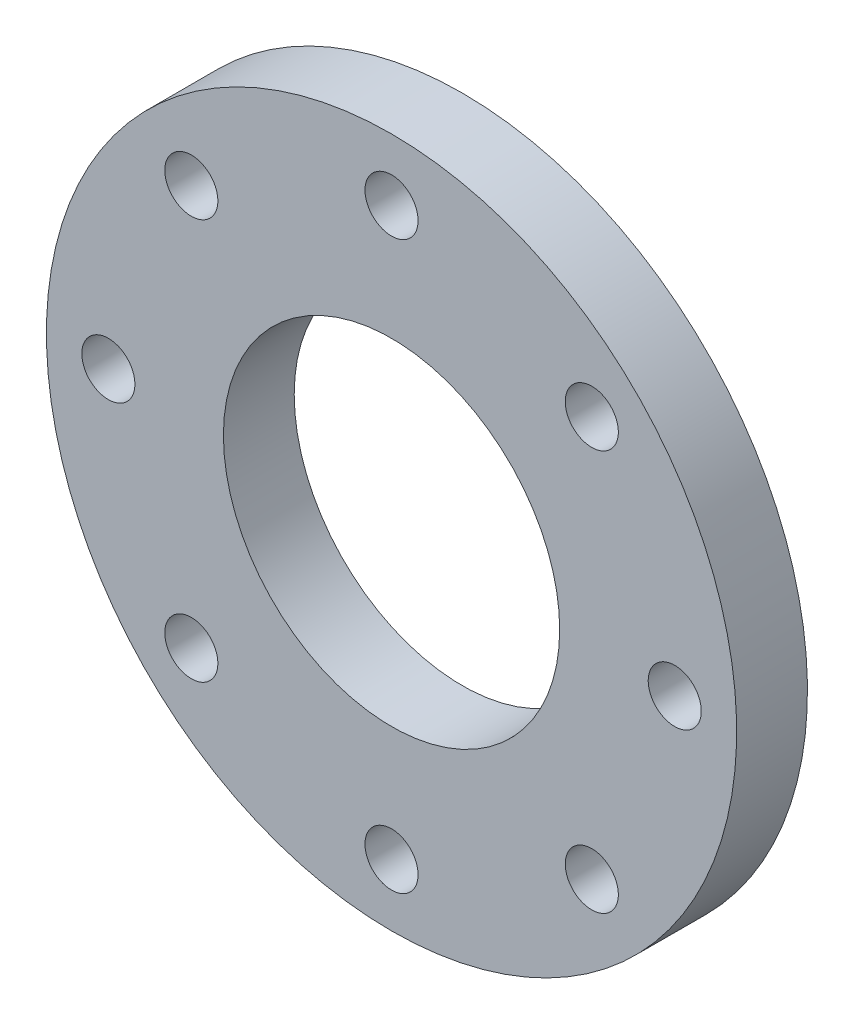
ISO-10303-21;
HEADER;
FILE_DESCRIPTION(('STEP AP214'),'2;1');
FILE_NAME('part.step','',(''),(''),'','','');
FILE_SCHEMA(('AUTOMOTIVE_DESIGN { 1 0 10303 214 1 1 1 1 }'));
ENDSEC;
DATA;
#1=APPLICATION_CONTEXT('core data for automotive mechanical design processes');
#2=APPLICATION_PROTOCOL_DEFINITION('international standard','automotive_design',2000,#1);
#3=PRODUCT_CONTEXT('',#1,'mechanical');
#4=PRODUCT('Part','Part','',(#3));
#5=PRODUCT_RELATED_PRODUCT_CATEGORY('part','',(#4));
#6=PRODUCT_DEFINITION_FORMATION('','',#4);
#7=PRODUCT_DEFINITION_CONTEXT('part definition',#1,'design');
#8=PRODUCT_DEFINITION('design','',#6,#7);
#9=PRODUCT_DEFINITION_SHAPE('','',#8);
#10=(LENGTH_UNIT() NAMED_UNIT(*) SI_UNIT(.MILLI.,.METRE.));
#11=(NAMED_UNIT(*) PLANE_ANGLE_UNIT() SI_UNIT($,.RADIAN.));
#12=(NAMED_UNIT(*) SI_UNIT($,.STERADIAN.) SOLID_ANGLE_UNIT());
#13=UNCERTAINTY_MEASURE_WITH_UNIT(LENGTH_MEASURE(1.E-05),#10,'distance_accuracy_value','');
#14=(GEOMETRIC_REPRESENTATION_CONTEXT(3) GLOBAL_UNCERTAINTY_ASSIGNED_CONTEXT((#13)) GLOBAL_UNIT_ASSIGNED_CONTEXT((#10,
#11,#12)) REPRESENTATION_CONTEXT('',''));
#15=CARTESIAN_POINT('',(0.,0.,0.));
#16=DIRECTION('',(0.,0.,1.));
#17=DIRECTION('',(1.,0.,0.));
#18=AXIS2_PLACEMENT_3D('',#15,#16,#17);
#19=CARTESIAN_POINT('',(0.,12.,-19.));
#20=DIRECTION('',(0.,0.,-1.));
#21=DIRECTION('',(-1.,0.,0.));
#22=AXIS2_PLACEMENT_3D('',#19,#20,#21);
#23=PLANE('',#22);
#24=CARTESIAN_POINT('',(5.65685424949245,17.6568542494924,-19.));
#25=DIRECTION('',(0.,0.,-1.));
#26=DIRECTION('',(-1.,0.,0.));
#27=AXIS2_PLACEMENT_3D('',#24,#25,#26);
#28=CIRCLE('',#27,0.749999999999922);
#29=CARTESIAN_POINT('',(4.90685424949253,17.6568542494924,-19.));
#30=VERTEX_POINT('',#29);
#31=EDGE_CURVE('E99',#30,#30,#28,.T.);
#32=ORIENTED_EDGE('',*,*,#31,.F.);
#33=EDGE_LOOP('',(#32));
#34=FACE_BOUND('',#33,.T.);
#35=CARTESIAN_POINT('',(-5.65685424949229,17.6568542494924,-19.));
#36=DIRECTION('',(0.,0.,-1.));
#37=DIRECTION('',(-1.,0.,0.));
#38=AXIS2_PLACEMENT_3D('',#35,#36,#37);
#39=CIRCLE('',#38,0.75);
#40=CARTESIAN_POINT('',(-6.40685424949229,17.6568542494924,-19.));
#41=VERTEX_POINT('',#40);
#42=EDGE_CURVE('E210',#41,#41,#39,.T.);
#43=ORIENTED_EDGE('',*,*,#42,.F.);
#44=EDGE_LOOP('',(#43));
#45=FACE_BOUND('',#44,.T.);
#46=CARTESIAN_POINT('',(-5.65685424949247,6.34314575050743,-19.));
#47=DIRECTION('',(0.,0.,-1.));
#48=DIRECTION('',(-1.,0.,0.));
#49=AXIS2_PLACEMENT_3D('',#46,#47,#48);
#50=CIRCLE('',#49,0.74999999999988);
#51=CARTESIAN_POINT('',(-6.40685424949235,6.34314575050743,-19.));
#52=VERTEX_POINT('',#51);
#53=EDGE_CURVE('E83',#52,#52,#50,.T.);
#54=ORIENTED_EDGE('',*,*,#53,.F.);
#55=EDGE_LOOP('',(#54));
#56=FACE_BOUND('',#55,.T.);
#57=CARTESIAN_POINT('',(5.65685424949246,6.34314575050743,-19.));
#58=DIRECTION('',(0.,0.,-1.));
#59=DIRECTION('',(-1.,0.,0.));
#60=AXIS2_PLACEMENT_3D('',#57,#58,#59);
#61=CIRCLE('',#60,0.749999999999748);
#62=CARTESIAN_POINT('',(4.90685424949271,6.34314575050743,-19.));
#63=VERTEX_POINT('',#62);
#64=EDGE_CURVE('E54',#63,#63,#61,.T.);
#65=ORIENTED_EDGE('',*,*,#64,.F.);
#66=EDGE_LOOP('',(#65));
#67=FACE_BOUND('',#66,.T.);
#68=CARTESIAN_POINT('',(0.,12.,-19.));
#69=DIRECTION('',(0.,0.,-1.));
#70=DIRECTION('',(-1.,0.,0.));
#71=AXIS2_PLACEMENT_3D('',#68,#69,#70);
#72=CIRCLE('',#71,9.75);
#73=CARTESIAN_POINT('',(-9.75000000000001,12.,-19.));
#74=VERTEX_POINT('',#73);
#75=EDGE_CURVE('E12',#74,#74,#72,.T.);
#76=ORIENTED_EDGE('',*,*,#75,.T.);
#77=EDGE_LOOP('',(#76));
#78=FACE_BOUND('',#77,.T.);
#79=CARTESIAN_POINT('',(8.00000000000011,12.,-19.));
#80=DIRECTION('',(0.,0.,-1.));
#81=DIRECTION('',(-1.,0.,0.));
#82=AXIS2_PLACEMENT_3D('',#79,#80,#81);
#83=CIRCLE('',#82,0.749999999999813);
#84=CARTESIAN_POINT('',(7.2500000000003,12.,-19.));
#85=VERTEX_POINT('',#84);
#86=EDGE_CURVE('E39',#85,#85,#83,.T.);
#87=ORIENTED_EDGE('',*,*,#86,.F.);
#88=EDGE_LOOP('',(#87));
#89=FACE_BOUND('',#88,.T.);
#90=CARTESIAN_POINT('',(0.,3.99999999999978,-19.));
#91=DIRECTION('',(0.,0.,-1.));
#92=DIRECTION('',(-1.,0.,0.));
#93=AXIS2_PLACEMENT_3D('',#90,#91,#92);
#94=CIRCLE('',#93,0.749999999999773);
#95=CARTESIAN_POINT('',(-0.749999999999778,3.99999999999978,-19.));
#96=VERTEX_POINT('',#95);
#97=EDGE_CURVE('E70',#96,#96,#94,.T.);
#98=ORIENTED_EDGE('',*,*,#97,.F.);
#99=EDGE_LOOP('',(#98));
#100=FACE_BOUND('',#99,.T.);
#101=CARTESIAN_POINT('',(-8.00000000000012,12.,-19.));
#102=DIRECTION('',(0.,0.,-1.));
#103=DIRECTION('',(-1.,0.,0.));
#104=AXIS2_PLACEMENT_3D('',#101,#102,#103);
#105=CIRCLE('',#104,0.750000000000017);
#106=CARTESIAN_POINT('',(-8.75000000000014,12.,-19.));
#107=VERTEX_POINT('',#106);
#108=EDGE_CURVE('E209',#107,#107,#105,.T.);
#109=ORIENTED_EDGE('',*,*,#108,.F.);
#110=EDGE_LOOP('',(#109));
#111=FACE_BOUND('',#110,.T.);
#112=CARTESIAN_POINT('',(0.,20.,-19.));
#113=DIRECTION('',(0.,0.,-1.));
#114=DIRECTION('',(-1.,0.,0.));
#115=AXIS2_PLACEMENT_3D('',#112,#113,#114);
#116=CIRCLE('',#115,0.75);
#117=CARTESIAN_POINT('',(-0.750000000000005,20.,-19.));
#118=VERTEX_POINT('',#117);
#119=EDGE_CURVE('E102',#118,#118,#116,.T.);
#120=ORIENTED_EDGE('',*,*,#119,.F.);
#121=EDGE_LOOP('',(#120));
#122=FACE_BOUND('',#121,.T.);
#123=CARTESIAN_POINT('',(0.,12.,-19.));
#124=DIRECTION('',(0.,0.,-1.));
#125=DIRECTION('',(-1.,0.,0.));
#126=AXIS2_PLACEMENT_3D('',#123,#124,#125);
#127=CIRCLE('',#126,4.75);
#128=CARTESIAN_POINT('',(-4.75,12.,-19.));
#129=VERTEX_POINT('',#128);
#130=EDGE_CURVE('E100',#129,#129,#127,.T.);
#131=ORIENTED_EDGE('',*,*,#130,.F.);
#132=EDGE_LOOP('',(#131));
#133=FACE_BOUND('',#132,.T.);
#134=ADVANCED_FACE('F19',(#34,#45,#56,#67,#78,#89,#100,#111,#122,#133),#23,.T.);
#135=CARTESIAN_POINT('',(0.,12.,-17.));
#136=DIRECTION('',(0.,0.,-1.));
#137=DIRECTION('',(-1.,0.,0.));
#138=AXIS2_PLACEMENT_3D('',#135,#136,#137);
#139=PLANE('',#138);
#140=CARTESIAN_POINT('',(0.,3.99999999999978,-17.));
#141=DIRECTION('',(0.,0.,-1.));
#142=DIRECTION('',(-1.,0.,0.));
#143=AXIS2_PLACEMENT_3D('',#140,#141,#142);
#144=CIRCLE('',#143,0.749999999999773);
#145=CARTESIAN_POINT('',(-0.749999999999778,3.99999999999978,-17.));
#146=VERTEX_POINT('',#145);
#147=EDGE_CURVE('E76',#146,#146,#144,.T.);
#148=ORIENTED_EDGE('',*,*,#147,.T.);
#149=EDGE_LOOP('',(#148));
#150=FACE_BOUND('',#149,.T.);
#151=CARTESIAN_POINT('',(5.65685424949245,17.6568542494924,-17.));
#152=DIRECTION('',(0.,0.,-1.));
#153=DIRECTION('',(-1.,0.,0.));
#154=AXIS2_PLACEMENT_3D('',#151,#152,#153);
#155=CIRCLE('',#154,0.749999999999922);
#156=CARTESIAN_POINT('',(4.90685424949253,17.6568542494924,-17.));
#157=VERTEX_POINT('',#156);
#158=EDGE_CURVE('E93',#157,#157,#155,.T.);
#159=ORIENTED_EDGE('',*,*,#158,.T.);
#160=EDGE_LOOP('',(#159));
#161=FACE_BOUND('',#160,.T.);
#162=CARTESIAN_POINT('',(-5.65685424949229,17.6568542494924,-17.));
#163=DIRECTION('',(0.,0.,-1.));
#164=DIRECTION('',(-1.,0.,0.));
#165=AXIS2_PLACEMENT_3D('',#162,#163,#164);
#166=CIRCLE('',#165,0.75);
#167=CARTESIAN_POINT('',(-6.40685424949229,17.6568542494924,-17.));
#168=VERTEX_POINT('',#167);
#169=EDGE_CURVE('E107',#168,#168,#166,.T.);
#170=ORIENTED_EDGE('',*,*,#169,.T.);
#171=EDGE_LOOP('',(#170));
#172=FACE_BOUND('',#171,.T.);
#173=CARTESIAN_POINT('',(-5.65685424949247,6.34314575050743,-17.));
#174=DIRECTION('',(0.,0.,-1.));
#175=DIRECTION('',(-1.,0.,0.));
#176=AXIS2_PLACEMENT_3D('',#173,#174,#175);
#177=CIRCLE('',#176,0.74999999999988);
#178=CARTESIAN_POINT('',(-6.40685424949235,6.34314575050743,-17.));
#179=VERTEX_POINT('',#178);
#180=EDGE_CURVE('E77',#179,#179,#177,.T.);
#181=ORIENTED_EDGE('',*,*,#180,.T.);
#182=EDGE_LOOP('',(#181));
#183=FACE_BOUND('',#182,.T.);
#184=CARTESIAN_POINT('',(5.65685424949246,6.34314575050743,-17.));
#185=DIRECTION('',(0.,0.,-1.));
#186=DIRECTION('',(-1.,0.,0.));
#187=AXIS2_PLACEMENT_3D('',#184,#185,#186);
#188=CIRCLE('',#187,0.749999999999748);
#189=CARTESIAN_POINT('',(4.90685424949271,6.34314575050743,-17.));
#190=VERTEX_POINT('',#189);
#191=EDGE_CURVE('E58',#190,#190,#188,.T.);
#192=ORIENTED_EDGE('',*,*,#191,.T.);
#193=EDGE_LOOP('',(#192));
#194=FACE_BOUND('',#193,.T.);
#195=CARTESIAN_POINT('',(8.00000000000011,12.,-17.));
#196=DIRECTION('',(0.,0.,-1.));
#197=DIRECTION('',(-1.,0.,0.));
#198=AXIS2_PLACEMENT_3D('',#195,#196,#197);
#199=CIRCLE('',#198,0.749999999999813);
#200=CARTESIAN_POINT('',(7.2500000000003,12.,-17.));
#201=VERTEX_POINT('',#200);
#202=EDGE_CURVE('E45',#201,#201,#199,.T.);
#203=ORIENTED_EDGE('',*,*,#202,.T.);
#204=EDGE_LOOP('',(#203));
#205=FACE_BOUND('',#204,.T.);
#206=CARTESIAN_POINT('',(0.,12.,-17.));
#207=DIRECTION('',(0.,0.,-1.));
#208=DIRECTION('',(-1.,0.,0.));
#209=AXIS2_PLACEMENT_3D('',#206,#207,#208);
#210=CIRCLE('',#209,9.75);
#211=CARTESIAN_POINT('',(0.,21.75,-17.));
#212=VERTEX_POINT('',#211);
#213=EDGE_CURVE('E23',#212,#212,#210,.T.);
#214=ORIENTED_EDGE('',*,*,#213,.F.);
#215=EDGE_LOOP('',(#214));
#216=FACE_BOUND('',#215,.T.);
#217=CARTESIAN_POINT('',(-8.00000000000012,12.,-17.));
#218=DIRECTION('',(0.,0.,-1.));
#219=DIRECTION('',(-1.,0.,0.));
#220=AXIS2_PLACEMENT_3D('',#217,#218,#219);
#221=CIRCLE('',#220,0.750000000000017);
#222=CARTESIAN_POINT('',(-8.75000000000014,12.,-17.));
#223=VERTEX_POINT('',#222);
#224=EDGE_CURVE('E206',#223,#223,#221,.T.);
#225=ORIENTED_EDGE('',*,*,#224,.T.);
#226=EDGE_LOOP('',(#225));
#227=FACE_BOUND('',#226,.T.);
#228=CARTESIAN_POINT('',(0.,20.,-17.));
#229=DIRECTION('',(0.,0.,-1.));
#230=DIRECTION('',(-1.,0.,0.));
#231=AXIS2_PLACEMENT_3D('',#228,#229,#230);
#232=CIRCLE('',#231,0.75);
#233=CARTESIAN_POINT('',(-0.750000000000005,20.,-17.));
#234=VERTEX_POINT('',#233);
#235=EDGE_CURVE('E108',#234,#234,#232,.T.);
#236=ORIENTED_EDGE('',*,*,#235,.T.);
#237=EDGE_LOOP('',(#236));
#238=FACE_BOUND('',#237,.T.);
#239=CARTESIAN_POINT('',(0.,12.,-17.));
#240=DIRECTION('',(0.,0.,-1.));
#241=DIRECTION('',(-1.,0.,0.));
#242=AXIS2_PLACEMENT_3D('',#239,#240,#241);
#243=CIRCLE('',#242,4.75);
#244=CARTESIAN_POINT('',(-4.75,12.,-17.));
#245=VERTEX_POINT('',#244);
#246=EDGE_CURVE('E115',#245,#245,#243,.T.);
#247=ORIENTED_EDGE('',*,*,#246,.T.);
#248=EDGE_LOOP('',(#247));
#249=FACE_BOUND('',#248,.T.);
#250=ADVANCED_FACE('F124',(#150,#161,#172,#183,#194,#205,#216,#227,#238,#249),#139,.F.);
#251=CARTESIAN_POINT('',(0.,12.,-19.));
#252=DIRECTION('',(0.,0.,1.));
#253=DIRECTION('',(1.,0.,0.));
#254=AXIS2_PLACEMENT_3D('',#251,#252,#253);
#255=CYLINDRICAL_SURFACE('',#254,9.75);
#256=ORIENTED_EDGE('',*,*,#75,.F.);
#257=EDGE_LOOP('',(#256));
#258=FACE_BOUND('',#257,.T.);
#259=ORIENTED_EDGE('',*,*,#213,.T.);
#260=EDGE_LOOP('',(#259));
#261=FACE_BOUND('',#260,.T.);
#262=ADVANCED_FACE('F21',(#258,#261),#255,.T.);
#263=CARTESIAN_POINT('',(8.00000000000011,12.,-19.));
#264=DIRECTION('',(0.,0.,1.));
#265=DIRECTION('',(1.,0.,0.));
#266=AXIS2_PLACEMENT_3D('',#263,#264,#265);
#267=CYLINDRICAL_SURFACE('',#266,0.749999999999813);
#268=ORIENTED_EDGE('',*,*,#86,.T.);
#269=EDGE_LOOP('',(#268));
#270=FACE_BOUND('',#269,.T.);
#271=ORIENTED_EDGE('',*,*,#202,.F.);
#272=EDGE_LOOP('',(#271));
#273=FACE_BOUND('',#272,.T.);
#274=ADVANCED_FACE('F148',(#270,#273),#267,.F.);
#275=CARTESIAN_POINT('',(5.65685424949246,6.34314575050743,-19.));
#276=DIRECTION('',(0.,0.,1.));
#277=DIRECTION('',(1.,0.,0.));
#278=AXIS2_PLACEMENT_3D('',#275,#276,#277);
#279=CYLINDRICAL_SURFACE('',#278,0.749999999999748);
#280=ORIENTED_EDGE('',*,*,#64,.T.);
#281=EDGE_LOOP('',(#280));
#282=FACE_BOUND('',#281,.T.);
#283=ORIENTED_EDGE('',*,*,#191,.F.);
#284=EDGE_LOOP('',(#283));
#285=FACE_BOUND('',#284,.T.);
#286=ADVANCED_FACE('F151',(#282,#285),#279,.F.);
#287=CARTESIAN_POINT('',(0.,3.99999999999978,-19.));
#288=DIRECTION('',(0.,0.,1.));
#289=DIRECTION('',(1.,0.,0.));
#290=AXIS2_PLACEMENT_3D('',#287,#288,#289);
#291=CYLINDRICAL_SURFACE('',#290,0.749999999999773);
#292=ORIENTED_EDGE('',*,*,#97,.T.);
#293=EDGE_LOOP('',(#292));
#294=FACE_BOUND('',#293,.T.);
#295=ORIENTED_EDGE('',*,*,#147,.F.);
#296=EDGE_LOOP('',(#295));
#297=FACE_BOUND('',#296,.T.);
#298=ADVANCED_FACE('F154',(#294,#297),#291,.F.);
#299=CARTESIAN_POINT('',(-5.65685424949247,6.34314575050743,-19.));
#300=DIRECTION('',(0.,0.,1.));
#301=DIRECTION('',(1.,0.,0.));
#302=AXIS2_PLACEMENT_3D('',#299,#300,#301);
#303=CYLINDRICAL_SURFACE('',#302,0.74999999999988);
#304=ORIENTED_EDGE('',*,*,#53,.T.);
#305=EDGE_LOOP('',(#304));
#306=FACE_BOUND('',#305,.T.);
#307=ORIENTED_EDGE('',*,*,#180,.F.);
#308=EDGE_LOOP('',(#307));
#309=FACE_BOUND('',#308,.T.);
#310=ADVANCED_FACE('F158',(#306,#309),#303,.F.);
#311=CARTESIAN_POINT('',(-8.00000000000012,12.,-19.));
#312=DIRECTION('',(0.,0.,1.));
#313=DIRECTION('',(1.,0.,0.));
#314=AXIS2_PLACEMENT_3D('',#311,#312,#313);
#315=CYLINDRICAL_SURFACE('',#314,0.750000000000017);
#316=ORIENTED_EDGE('',*,*,#108,.T.);
#317=EDGE_LOOP('',(#316));
#318=FACE_BOUND('',#317,.T.);
#319=ORIENTED_EDGE('',*,*,#224,.F.);
#320=EDGE_LOOP('',(#319));
#321=FACE_BOUND('',#320,.T.);
#322=ADVANCED_FACE('F162',(#318,#321),#315,.F.);
#323=CARTESIAN_POINT('',(-5.65685424949229,17.6568542494924,-19.));
#324=DIRECTION('',(0.,0.,1.));
#325=DIRECTION('',(1.,0.,0.));
#326=AXIS2_PLACEMENT_3D('',#323,#324,#325);
#327=CYLINDRICAL_SURFACE('',#326,0.75);
#328=ORIENTED_EDGE('',*,*,#42,.T.);
#329=EDGE_LOOP('',(#328));
#330=FACE_BOUND('',#329,.T.);
#331=ORIENTED_EDGE('',*,*,#169,.F.);
#332=EDGE_LOOP('',(#331));
#333=FACE_BOUND('',#332,.T.);
#334=ADVANCED_FACE('F166',(#330,#333),#327,.F.);
#335=CARTESIAN_POINT('',(0.,20.,-19.));
#336=DIRECTION('',(0.,0.,1.));
#337=DIRECTION('',(1.,0.,0.));
#338=AXIS2_PLACEMENT_3D('',#335,#336,#337);
#339=CYLINDRICAL_SURFACE('',#338,0.75);
#340=ORIENTED_EDGE('',*,*,#119,.T.);
#341=EDGE_LOOP('',(#340));
#342=FACE_BOUND('',#341,.T.);
#343=ORIENTED_EDGE('',*,*,#235,.F.);
#344=EDGE_LOOP('',(#343));
#345=FACE_BOUND('',#344,.T.);
#346=ADVANCED_FACE('F135',(#342,#345),#339,.F.);
#347=CARTESIAN_POINT('',(5.65685424949245,17.6568542494924,-19.));
#348=DIRECTION('',(0.,0.,1.));
#349=DIRECTION('',(1.,0.,0.));
#350=AXIS2_PLACEMENT_3D('',#347,#348,#349);
#351=CYLINDRICAL_SURFACE('',#350,0.749999999999922);
#352=ORIENTED_EDGE('',*,*,#31,.T.);
#353=EDGE_LOOP('',(#352));
#354=FACE_BOUND('',#353,.T.);
#355=ORIENTED_EDGE('',*,*,#158,.F.);
#356=EDGE_LOOP('',(#355));
#357=FACE_BOUND('',#356,.T.);
#358=ADVANCED_FACE('F128',(#354,#357),#351,.F.);
#359=CARTESIAN_POINT('',(0.,12.,-19.));
#360=DIRECTION('',(0.,0.,1.));
#361=DIRECTION('',(1.,0.,0.));
#362=AXIS2_PLACEMENT_3D('',#359,#360,#361);
#363=CYLINDRICAL_SURFACE('',#362,4.75);
#364=ORIENTED_EDGE('',*,*,#130,.T.);
#365=EDGE_LOOP('',(#364));
#366=FACE_BOUND('',#365,.T.);
#367=ORIENTED_EDGE('',*,*,#246,.F.);
#368=EDGE_LOOP('',(#367));
#369=FACE_BOUND('',#368,.T.);
#370=ADVANCED_FACE('F126',(#366,#369),#363,.F.);
#371=CLOSED_SHELL('',(#134,#250,#262,#274,#286,#298,#310,#322,#334,#346,#358,#370));
#372=MANIFOLD_SOLID_BREP('B1',#371);
#373=ADVANCED_BREP_SHAPE_REPRESENTATION('',(#18,#372),#14);
#374=SHAPE_DEFINITION_REPRESENTATION(#9,#373);
ENDSEC;
END-ISO-10303-21;
